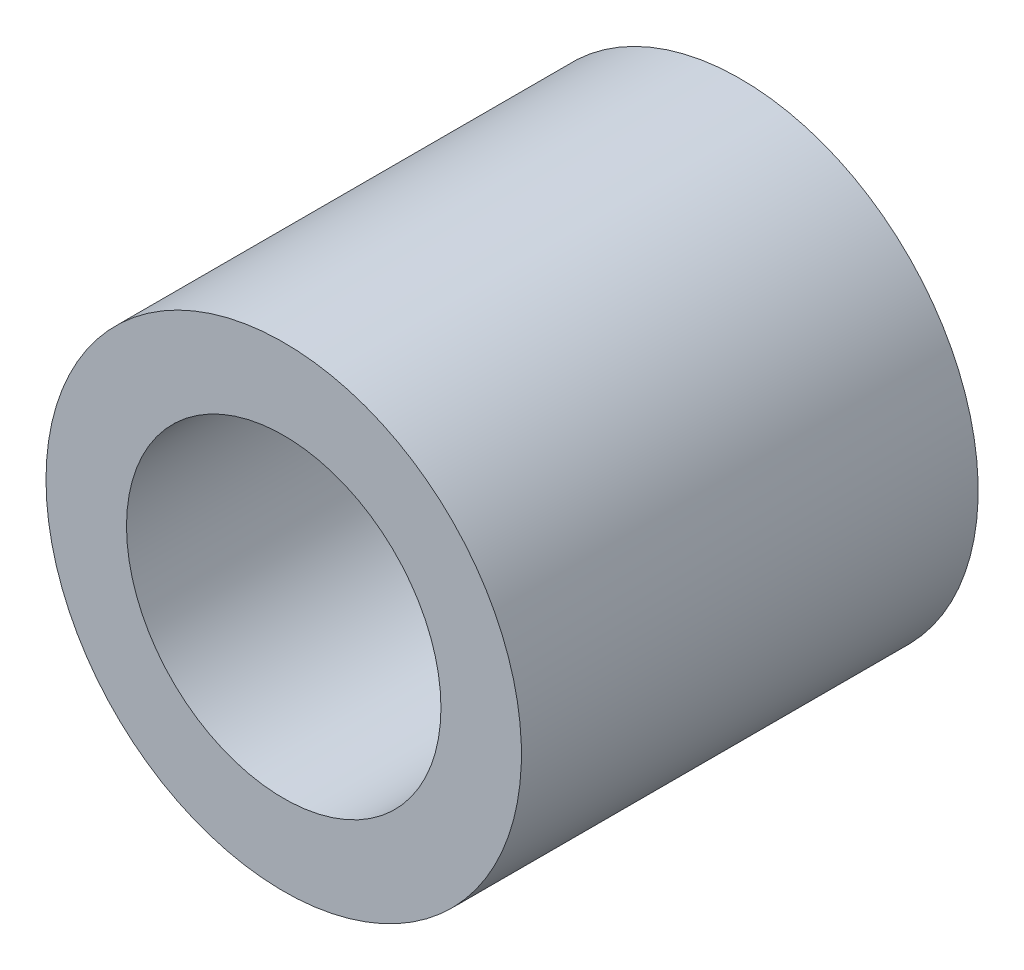
ISO-10303-21;
HEADER;
FILE_DESCRIPTION(('STEP AP214'),'2;1');
FILE_NAME('part.step','',(''),(''),'','','');
FILE_SCHEMA(('AUTOMOTIVE_DESIGN { 1 0 10303 214 1 1 1 1 }'));
ENDSEC;
DATA;
#1=APPLICATION_CONTEXT('core data for automotive mechanical design processes');
#2=APPLICATION_PROTOCOL_DEFINITION('international standard','automotive_design',2000,#1);
#3=PRODUCT_CONTEXT('',#1,'mechanical');
#4=PRODUCT('Part','Part','',(#3));
#5=PRODUCT_RELATED_PRODUCT_CATEGORY('part','',(#4));
#6=PRODUCT_DEFINITION_FORMATION('','',#4);
#7=PRODUCT_DEFINITION_CONTEXT('part definition',#1,'design');
#8=PRODUCT_DEFINITION('design','',#6,#7);
#9=PRODUCT_DEFINITION_SHAPE('','',#8);
#10=(LENGTH_UNIT() NAMED_UNIT(*) SI_UNIT(.MILLI.,.METRE.));
#11=(NAMED_UNIT(*) PLANE_ANGLE_UNIT() SI_UNIT($,.RADIAN.));
#12=(NAMED_UNIT(*) SI_UNIT($,.STERADIAN.) SOLID_ANGLE_UNIT());
#13=UNCERTAINTY_MEASURE_WITH_UNIT(LENGTH_MEASURE(1.E-05),#10,'distance_accuracy_value','');
#14=(GEOMETRIC_REPRESENTATION_CONTEXT(3) GLOBAL_UNCERTAINTY_ASSIGNED_CONTEXT((#13)) GLOBAL_UNIT_ASSIGNED_CONTEXT((#10,
#11,#12)) REPRESENTATION_CONTEXT('',''));
#15=CARTESIAN_POINT('',(0.,0.,0.));
#16=DIRECTION('',(0.,0.,1.));
#17=DIRECTION('',(1.,0.,0.));
#18=AXIS2_PLACEMENT_3D('',#15,#16,#17);
#19=CARTESIAN_POINT('',(0.,0.,15.25));
#20=DIRECTION('',(0.,0.,1.));
#21=DIRECTION('',(1.,0.,0.));
#22=AXIS2_PLACEMENT_3D('',#19,#20,#21);
#23=PLANE('',#22);
#24=CARTESIAN_POINT('',(0.,0.,15.25));
#25=DIRECTION('',(0.,0.,1.));
#26=DIRECTION('',(1.,0.,0.));
#27=AXIS2_PLACEMENT_3D('',#24,#25,#26);
#28=CIRCLE('',#27,7.9375);
#29=CARTESIAN_POINT('',(-7.9375,0.,15.25));
#30=VERTEX_POINT('',#29);
#31=EDGE_CURVE('E10',#30,#30,#28,.T.);
#32=ORIENTED_EDGE('',*,*,#31,.T.);
#33=EDGE_LOOP('',(#32));
#34=FACE_BOUND('',#33,.T.);
#35=CARTESIAN_POINT('',(0.,0.,15.25));
#36=DIRECTION('',(0.,0.,1.));
#37=DIRECTION('',(1.,0.,0.));
#38=AXIS2_PLACEMENT_3D('',#35,#36,#37);
#39=CIRCLE('',#38,5.25);
#40=CARTESIAN_POINT('',(-5.25,0.,15.25));
#41=VERTEX_POINT('',#40);
#42=EDGE_CURVE('E45',#41,#41,#39,.T.);
#43=ORIENTED_EDGE('',*,*,#42,.F.);
#44=EDGE_LOOP('',(#43));
#45=FACE_BOUND('',#44,.T.);
#46=ADVANCED_FACE('F34',(#34,#45),#23,.T.);
#47=CARTESIAN_POINT('',(0.,0.,0.));
#48=DIRECTION('',(0.,0.,1.));
#49=DIRECTION('',(1.,0.,0.));
#50=AXIS2_PLACEMENT_3D('',#47,#48,#49);
#51=PLANE('',#50);
#52=CARTESIAN_POINT('',(0.,0.,0.));
#53=DIRECTION('',(0.,0.,1.));
#54=DIRECTION('',(1.,0.,0.));
#55=AXIS2_PLACEMENT_3D('',#52,#53,#54);
#56=CIRCLE('',#55,7.9375);
#57=CARTESIAN_POINT('',(-7.9375,0.,0.));
#58=VERTEX_POINT('',#57);
#59=EDGE_CURVE('E38',#58,#58,#56,.T.);
#60=ORIENTED_EDGE('',*,*,#59,.F.);
#61=EDGE_LOOP('',(#60));
#62=FACE_BOUND('',#61,.T.);
#63=CARTESIAN_POINT('',(0.,0.,0.));
#64=DIRECTION('',(0.,0.,1.));
#65=DIRECTION('',(1.,0.,0.));
#66=AXIS2_PLACEMENT_3D('',#63,#64,#65);
#67=CIRCLE('',#66,5.25);
#68=CARTESIAN_POINT('',(-5.25,0.,0.));
#69=VERTEX_POINT('',#68);
#70=EDGE_CURVE('E47',#69,#69,#67,.T.);
#71=ORIENTED_EDGE('',*,*,#70,.T.);
#72=EDGE_LOOP('',(#71));
#73=FACE_BOUND('',#72,.T.);
#74=ADVANCED_FACE('F57',(#62,#73),#51,.F.);
#75=CARTESIAN_POINT('',(0.,0.,15.25));
#76=DIRECTION('',(0.,0.,-1.));
#77=DIRECTION('',(-1.,0.,0.));
#78=AXIS2_PLACEMENT_3D('',#75,#76,#77);
#79=CYLINDRICAL_SURFACE('',#78,7.9375);
#80=CARTESIAN_POINT('',(-7.9375,0.,15.25));
#81=CARTESIAN_POINT('',(-7.9375,0.,15.0911458333333));
#82=CARTESIAN_POINT('',(-7.9375,0.,14.9322916666667));
#83=CARTESIAN_POINT('',(-7.9375,0.,14.6145833333333));
#84=CARTESIAN_POINT('',(-7.9375,0.,14.4557291666667));
#85=CARTESIAN_POINT('',(-7.9375,0.,14.1380208333333));
#86=CARTESIAN_POINT('',(-7.9375,0.,13.9791666666667));
#87=CARTESIAN_POINT('',(-7.9375,0.,13.6614583333333));
#88=CARTESIAN_POINT('',(-7.9375,0.,13.5026041666667));
#89=CARTESIAN_POINT('',(-7.9375,0.,13.1848958333333));
#90=CARTESIAN_POINT('',(-7.9375,0.,13.0260416666667));
#91=CARTESIAN_POINT('',(-7.9375,0.,12.7083333333333));
#92=CARTESIAN_POINT('',(-7.9375,0.,12.5494791666667));
#93=CARTESIAN_POINT('',(-7.9375,0.,12.2317708333333));
#94=CARTESIAN_POINT('',(-7.9375,0.,12.0729166666667));
#95=CARTESIAN_POINT('',(-7.9375,0.,11.7552083333333));
#96=CARTESIAN_POINT('',(-7.9375,0.,11.5963541666667));
#97=CARTESIAN_POINT('',(-7.9375,0.,11.2786458333333));
#98=CARTESIAN_POINT('',(-7.9375,0.,11.1197916666667));
#99=CARTESIAN_POINT('',(-7.9375,0.,10.8020833333333));
#100=CARTESIAN_POINT('',(-7.9375,0.,10.6432291666667));
#101=CARTESIAN_POINT('',(-7.9375,0.,10.3255208333333));
#102=CARTESIAN_POINT('',(-7.9375,0.,10.1666666666667));
#103=CARTESIAN_POINT('',(-7.9375,0.,9.84895833333333));
#104=CARTESIAN_POINT('',(-7.9375,0.,9.69010416666666));
#105=CARTESIAN_POINT('',(-7.9375,0.,9.37239583333333));
#106=CARTESIAN_POINT('',(-7.9375,0.,9.21354166666666));
#107=CARTESIAN_POINT('',(-7.9375,0.,8.89583333333333));
#108=CARTESIAN_POINT('',(-7.9375,0.,8.73697916666667));
#109=CARTESIAN_POINT('',(-7.9375,0.,8.41927083333333));
#110=CARTESIAN_POINT('',(-7.9375,0.,8.26041666666667));
#111=CARTESIAN_POINT('',(-7.9375,0.,7.94270833333333));
#112=CARTESIAN_POINT('',(-7.9375,0.,7.78385416666667));
#113=CARTESIAN_POINT('',(-7.9375,0.,7.46614583333333));
#114=CARTESIAN_POINT('',(-7.9375,0.,7.30729166666667));
#115=CARTESIAN_POINT('',(-7.9375,0.,6.98958333333333));
#116=CARTESIAN_POINT('',(-7.9375,0.,6.83072916666667));
#117=CARTESIAN_POINT('',(-7.9375,0.,6.51302083333333));
#118=CARTESIAN_POINT('',(-7.9375,0.,6.35416666666667));
#119=CARTESIAN_POINT('',(-7.9375,0.,6.03645833333333));
#120=CARTESIAN_POINT('',(-7.9375,0.,5.87760416666667));
#121=CARTESIAN_POINT('',(-7.9375,0.,5.55989583333333));
#122=CARTESIAN_POINT('',(-7.9375,0.,5.40104166666667));
#123=CARTESIAN_POINT('',(-7.9375,0.,5.08333333333333));
#124=CARTESIAN_POINT('',(-7.9375,0.,4.92447916666667));
#125=CARTESIAN_POINT('',(-7.9375,0.,4.60677083333333));
#126=CARTESIAN_POINT('',(-7.9375,0.,4.44791666666667));
#127=CARTESIAN_POINT('',(-7.9375,0.,4.13020833333333));
#128=CARTESIAN_POINT('',(-7.9375,0.,3.97135416666667));
#129=CARTESIAN_POINT('',(-7.9375,0.,3.65364583333333));
#130=CARTESIAN_POINT('',(-7.9375,0.,3.49479166666667));
#131=CARTESIAN_POINT('',(-7.9375,0.,3.17708333333333));
#132=CARTESIAN_POINT('',(-7.9375,0.,3.01822916666667));
#133=CARTESIAN_POINT('',(-7.9375,0.,2.70052083333333));
#134=CARTESIAN_POINT('',(-7.9375,0.,2.54166666666666));
#135=CARTESIAN_POINT('',(-7.9375,0.,2.22395833333333));
#136=CARTESIAN_POINT('',(-7.9375,0.,2.06510416666666));
#137=CARTESIAN_POINT('',(-7.9375,0.,1.74739583333333));
#138=CARTESIAN_POINT('',(-7.9375,0.,1.58854166666667));
#139=CARTESIAN_POINT('',(-7.9375,0.,1.27083333333333));
#140=CARTESIAN_POINT('',(-7.9375,0.,1.11197916666667));
#141=CARTESIAN_POINT('',(-7.9375,0.,0.794270833333332));
#142=CARTESIAN_POINT('',(-7.9375,0.,0.635416666666665));
#143=CARTESIAN_POINT('',(-7.9375,0.,0.317708333333331));
#144=CARTESIAN_POINT('',(-7.9375,0.,0.158854166666665));
#145=CARTESIAN_POINT('',(-7.9375,0.,0.));
#146=B_SPLINE_CURVE_WITH_KNOTS('',3,(#80,#81,#82,#83,#84,#85,#86,#87,#88,#89,#90,#91,#92,#93,
#94,#95,#96,#97,#98,#99,#100,#101,#102,#103,#104,#105,#106,#107,#108,#109,#110,#111,#112,#113,
#114,#115,#116,#117,#118,#119,#120,#121,#122,#123,#124,#125,#126,#127,#128,#129,#130,#131,#132,
#133,#134,#135,#136,#137,#138,#139,#140,#141,#142,#143,#144,#145),.UNSPECIFIED.,.F.,.F.,(4,2,2,
2,2,2,2,2,2,2,2,2,2,2,2,2,2,2,2,2,2,2,2,2,2,2,2,2,2,2,2,2,4),(0.,0.4765625,0.953124999999999,
1.4296875,1.90625,2.3828125,2.859375,3.3359375,3.8125,4.2890625,4.765625,5.2421875,5.71875,
6.1953125,6.671875,7.1484375,7.625,8.1015625,8.578125,9.0546875,9.53125,10.0078125,10.484375,
10.9609375,11.4375,11.9140625,12.390625,12.8671875,13.34375,13.8203125,14.296875,14.7734375,
15.25),.UNSPECIFIED.);
#147=EDGE_CURVE('BSEAM36',#30,#58,#146,.T.);
#148=ORIENTED_EDGE('',*,*,#31,.F.);
#149=ORIENTED_EDGE('',*,*,#59,.T.);
#150=ORIENTED_EDGE('',*,*,#147,.T.);
#151=ORIENTED_EDGE('',*,*,#147,.F.);
#152=EDGE_LOOP('',(#148,#150,#149,#151));
#153=FACE_BOUND('',#152,.T.);
#154=ADVANCED_FACE('F36',(#153),#79,.T.);
#155=CARTESIAN_POINT('',(0.,0.,15.25));
#156=DIRECTION('',(0.,0.,-1.));
#157=DIRECTION('',(-1.,0.,0.));
#158=AXIS2_PLACEMENT_3D('',#155,#156,#157);
#159=CYLINDRICAL_SURFACE('',#158,5.25);
#160=CARTESIAN_POINT('',(-5.25,0.,15.25));
#161=CARTESIAN_POINT('',(-5.25,0.,15.0911458333333));
#162=CARTESIAN_POINT('',(-5.25,0.,14.9322916666667));
#163=CARTESIAN_POINT('',(-5.25,0.,14.6145833333333));
#164=CARTESIAN_POINT('',(-5.25,0.,14.4557291666667));
#165=CARTESIAN_POINT('',(-5.25,0.,14.1380208333333));
#166=CARTESIAN_POINT('',(-5.25,0.,13.9791666666667));
#167=CARTESIAN_POINT('',(-5.25,0.,13.6614583333333));
#168=CARTESIAN_POINT('',(-5.25,0.,13.5026041666667));
#169=CARTESIAN_POINT('',(-5.25,0.,13.1848958333333));
#170=CARTESIAN_POINT('',(-5.25,0.,13.0260416666667));
#171=CARTESIAN_POINT('',(-5.25,0.,12.7083333333333));
#172=CARTESIAN_POINT('',(-5.25,0.,12.5494791666667));
#173=CARTESIAN_POINT('',(-5.25,0.,12.2317708333333));
#174=CARTESIAN_POINT('',(-5.25,0.,12.0729166666667));
#175=CARTESIAN_POINT('',(-5.25,0.,11.7552083333333));
#176=CARTESIAN_POINT('',(-5.25,0.,11.5963541666667));
#177=CARTESIAN_POINT('',(-5.25,0.,11.2786458333333));
#178=CARTESIAN_POINT('',(-5.25,0.,11.1197916666667));
#179=CARTESIAN_POINT('',(-5.25,0.,10.8020833333333));
#180=CARTESIAN_POINT('',(-5.25,0.,10.6432291666667));
#181=CARTESIAN_POINT('',(-5.25,0.,10.3255208333333));
#182=CARTESIAN_POINT('',(-5.25,0.,10.1666666666667));
#183=CARTESIAN_POINT('',(-5.25,0.,9.84895833333333));
#184=CARTESIAN_POINT('',(-5.25,0.,9.69010416666666));
#185=CARTESIAN_POINT('',(-5.25,0.,9.37239583333333));
#186=CARTESIAN_POINT('',(-5.25,0.,9.21354166666666));
#187=CARTESIAN_POINT('',(-5.25,0.,8.89583333333333));
#188=CARTESIAN_POINT('',(-5.25,0.,8.73697916666667));
#189=CARTESIAN_POINT('',(-5.25,0.,8.41927083333333));
#190=CARTESIAN_POINT('',(-5.25,0.,8.26041666666667));
#191=CARTESIAN_POINT('',(-5.25,0.,7.94270833333333));
#192=CARTESIAN_POINT('',(-5.25,0.,7.78385416666667));
#193=CARTESIAN_POINT('',(-5.25,0.,7.46614583333333));
#194=CARTESIAN_POINT('',(-5.25,0.,7.30729166666667));
#195=CARTESIAN_POINT('',(-5.25,0.,6.98958333333333));
#196=CARTESIAN_POINT('',(-5.25,0.,6.83072916666667));
#197=CARTESIAN_POINT('',(-5.25,0.,6.51302083333333));
#198=CARTESIAN_POINT('',(-5.25,0.,6.35416666666667));
#199=CARTESIAN_POINT('',(-5.25,0.,6.03645833333333));
#200=CARTESIAN_POINT('',(-5.25,0.,5.87760416666667));
#201=CARTESIAN_POINT('',(-5.25,0.,5.55989583333333));
#202=CARTESIAN_POINT('',(-5.25,0.,5.40104166666667));
#203=CARTESIAN_POINT('',(-5.25,0.,5.08333333333333));
#204=CARTESIAN_POINT('',(-5.25,0.,4.92447916666667));
#205=CARTESIAN_POINT('',(-5.25,0.,4.60677083333333));
#206=CARTESIAN_POINT('',(-5.25,0.,4.44791666666667));
#207=CARTESIAN_POINT('',(-5.25,0.,4.13020833333333));
#208=CARTESIAN_POINT('',(-5.25,0.,3.97135416666667));
#209=CARTESIAN_POINT('',(-5.25,0.,3.65364583333333));
#210=CARTESIAN_POINT('',(-5.25,0.,3.49479166666667));
#211=CARTESIAN_POINT('',(-5.25,0.,3.17708333333333));
#212=CARTESIAN_POINT('',(-5.25,0.,3.01822916666667));
#213=CARTESIAN_POINT('',(-5.25,0.,2.70052083333333));
#214=CARTESIAN_POINT('',(-5.25,0.,2.54166666666667));
#215=CARTESIAN_POINT('',(-5.25,0.,2.22395833333333));
#216=CARTESIAN_POINT('',(-5.25,0.,2.06510416666667));
#217=CARTESIAN_POINT('',(-5.25,0.,1.74739583333333));
#218=CARTESIAN_POINT('',(-5.25,0.,1.58854166666667));
#219=CARTESIAN_POINT('',(-5.25,0.,1.27083333333333));
#220=CARTESIAN_POINT('',(-5.25,0.,1.11197916666667));
#221=CARTESIAN_POINT('',(-5.25,0.,0.794270833333332));
#222=CARTESIAN_POINT('',(-5.25,0.,0.635416666666665));
#223=CARTESIAN_POINT('',(-5.25,0.,0.317708333333331));
#224=CARTESIAN_POINT('',(-5.25,0.,0.158854166666665));
#225=CARTESIAN_POINT('',(-5.25,0.,0.));
#226=B_SPLINE_CURVE_WITH_KNOTS('',3,(#160,#161,#162,#163,#164,#165,#166,#167,#168,#169,#170,
#171,#172,#173,#174,#175,#176,#177,#178,#179,#180,#181,#182,#183,#184,#185,#186,#187,#188,#189,
#190,#191,#192,#193,#194,#195,#196,#197,#198,#199,#200,#201,#202,#203,#204,#205,#206,#207,#208,
#209,#210,#211,#212,#213,#214,#215,#216,#217,#218,#219,#220,#221,#222,#223,#224,#225),
.UNSPECIFIED.,.F.,.F.,(4,2,2,2,2,2,2,2,2,2,2,2,2,2,2,2,2,2,2,2,2,2,2,2,2,2,2,2,2,2,2,2,4),(0.,
0.476562500000001,0.953125000000001,1.4296875,1.90625,2.3828125,2.859375,3.3359375,3.8125,
4.2890625,4.765625,5.2421875,5.71875,6.1953125,6.671875,7.1484375,7.625,8.1015625,8.578125,
9.0546875,9.53125,10.0078125,10.484375,10.9609375,11.4375,11.9140625,12.390625,12.8671875,
13.34375,13.8203125,14.296875,14.7734375,15.25),.UNSPECIFIED.);
#227=EDGE_CURVE('BSEAM53',#41,#69,#226,.T.);
#228=ORIENTED_EDGE('',*,*,#42,.T.);
#229=ORIENTED_EDGE('',*,*,#70,.F.);
#230=ORIENTED_EDGE('',*,*,#227,.T.);
#231=ORIENTED_EDGE('',*,*,#227,.F.);
#232=EDGE_LOOP('',(#228,#230,#229,#231));
#233=FACE_BOUND('',#232,.T.);
#234=ADVANCED_FACE('F53',(#233),#159,.F.);
#235=CLOSED_SHELL('',(#46,#74,#154,#234));
#236=MANIFOLD_SOLID_BREP('B2',#235);
#237=ADVANCED_BREP_SHAPE_REPRESENTATION('',(#18,#236),#14);
#238=SHAPE_DEFINITION_REPRESENTATION(#9,#237);
ENDSEC;
END-ISO-10303-21;
